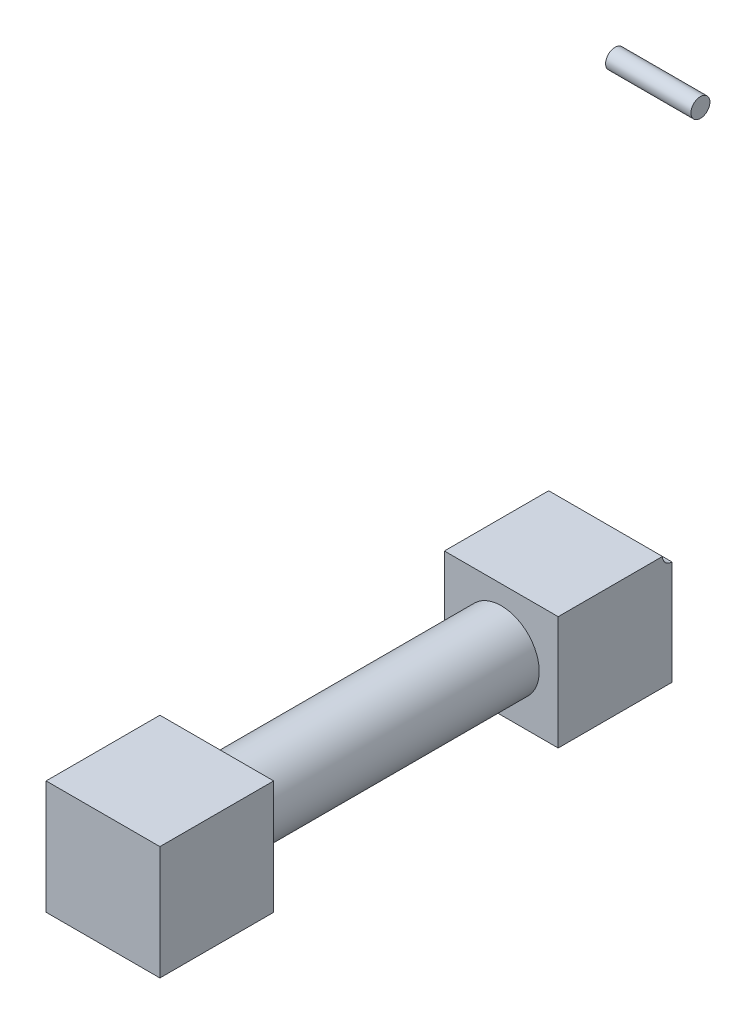
ISO-10303-21;
HEADER;
FILE_DESCRIPTION(('STEP AP214'),'2;1');
FILE_NAME('part.step','',(''),(''),'','','');
FILE_SCHEMA(('AUTOMOTIVE_DESIGN { 1 0 10303 214 1 1 1 1 }'));
ENDSEC;
DATA;
#1=APPLICATION_CONTEXT('core data for automotive mechanical design processes');
#2=APPLICATION_PROTOCOL_DEFINITION('international standard','automotive_design',2000,#1);
#3=PRODUCT_CONTEXT('',#1,'mechanical');
#4=PRODUCT('Part','Part','',(#3));
#5=PRODUCT_RELATED_PRODUCT_CATEGORY('part','',(#4));
#6=PRODUCT_DEFINITION_FORMATION('','',#4);
#7=PRODUCT_DEFINITION_CONTEXT('part definition',#1,'design');
#8=PRODUCT_DEFINITION('design','',#6,#7);
#9=PRODUCT_DEFINITION_SHAPE('','',#8);
#10=(LENGTH_UNIT() NAMED_UNIT(*) SI_UNIT(.MILLI.,.METRE.));
#11=(NAMED_UNIT(*) PLANE_ANGLE_UNIT() SI_UNIT($,.RADIAN.));
#12=(NAMED_UNIT(*) SI_UNIT($,.STERADIAN.) SOLID_ANGLE_UNIT());
#13=UNCERTAINTY_MEASURE_WITH_UNIT(LENGTH_MEASURE(1.E-05),#10,'distance_accuracy_value','');
#14=(GEOMETRIC_REPRESENTATION_CONTEXT(3) GLOBAL_UNCERTAINTY_ASSIGNED_CONTEXT((#13)) GLOBAL_UNIT_ASSIGNED_CONTEXT((#10,
#11,#12)) REPRESENTATION_CONTEXT('',''));
#15=CARTESIAN_POINT('',(0.,0.,0.));
#16=DIRECTION('',(0.,0.,1.));
#17=DIRECTION('',(1.,0.,0.));
#18=AXIS2_PLACEMENT_3D('',#15,#16,#17);
#19=CARTESIAN_POINT('',(45.,240.,0.));
#20=DIRECTION('',(-1.,0.,0.));
#21=DIRECTION('',(0.,0.,1.));
#22=AXIS2_PLACEMENT_3D('',#19,#20,#21);
#23=CYLINDRICAL_SURFACE('',#22,5.);
#24=CARTESIAN_POINT('',(45.,240.,0.));
#25=DIRECTION('',(1.,0.,0.));
#26=DIRECTION('',(0.,0.,-1.));
#27=AXIS2_PLACEMENT_3D('',#24,#25,#26);
#28=CIRCLE('',#27,5.);
#29=CARTESIAN_POINT('',(45.,240.,5.));
#30=VERTEX_POINT('',#29);
#31=EDGE_CURVE('E11',#30,#30,#28,.T.);
#32=CARTESIAN_POINT('',(0.,240.,0.));
#33=DIRECTION('',(1.,0.,0.));
#34=DIRECTION('',(0.,0.,-1.));
#35=AXIS2_PLACEMENT_3D('',#32,#33,#34);
#36=CIRCLE('',#35,5.);
#37=CARTESIAN_POINT('',(0.,240.,5.));
#38=VERTEX_POINT('',#37);
#39=EDGE_CURVE('E49',#38,#38,#36,.T.);
#40=CARTESIAN_POINT('',(45.,240.,5.));
#41=CARTESIAN_POINT('',(44.53125,240.,5.));
#42=CARTESIAN_POINT('',(44.0625,240.,5.));
#43=CARTESIAN_POINT('',(43.125,240.,5.));
#44=CARTESIAN_POINT('',(42.65625,240.,5.));
#45=CARTESIAN_POINT('',(41.71875,240.,5.));
#46=CARTESIAN_POINT('',(41.25,240.,5.));
#47=CARTESIAN_POINT('',(40.3125,240.,5.));
#48=CARTESIAN_POINT('',(39.84375,240.,5.));
#49=CARTESIAN_POINT('',(38.90625,240.,5.));
#50=CARTESIAN_POINT('',(38.4375,240.,5.));
#51=CARTESIAN_POINT('',(37.5,240.,5.));
#52=CARTESIAN_POINT('',(37.03125,240.,5.));
#53=CARTESIAN_POINT('',(36.09375,240.,5.));
#54=CARTESIAN_POINT('',(35.625,240.,5.));
#55=CARTESIAN_POINT('',(34.6875,240.,5.));
#56=CARTESIAN_POINT('',(34.21875,240.,5.));
#57=CARTESIAN_POINT('',(33.28125,240.,5.));
#58=CARTESIAN_POINT('',(32.8125,240.,5.));
#59=CARTESIAN_POINT('',(31.875,240.,5.));
#60=CARTESIAN_POINT('',(31.40625,240.,5.));
#61=CARTESIAN_POINT('',(30.46875,240.,5.));
#62=CARTESIAN_POINT('',(30.,240.,5.));
#63=CARTESIAN_POINT('',(29.0625,240.,5.));
#64=CARTESIAN_POINT('',(28.59375,240.,5.));
#65=CARTESIAN_POINT('',(27.65625,240.,5.));
#66=CARTESIAN_POINT('',(27.1875,240.,5.));
#67=CARTESIAN_POINT('',(26.25,240.,5.));
#68=CARTESIAN_POINT('',(25.78125,240.,5.));
#69=CARTESIAN_POINT('',(24.84375,240.,5.));
#70=CARTESIAN_POINT('',(24.375,240.,5.));
#71=CARTESIAN_POINT('',(23.4375,240.,5.));
#72=CARTESIAN_POINT('',(22.96875,240.,5.));
#73=CARTESIAN_POINT('',(22.03125,240.,5.));
#74=CARTESIAN_POINT('',(21.5625,240.,5.));
#75=CARTESIAN_POINT('',(20.625,240.,5.));
#76=CARTESIAN_POINT('',(20.15625,240.,5.));
#77=CARTESIAN_POINT('',(19.21875,240.,5.));
#78=CARTESIAN_POINT('',(18.75,240.,5.));
#79=CARTESIAN_POINT('',(17.8125,240.,5.));
#80=CARTESIAN_POINT('',(17.34375,240.,5.));
#81=CARTESIAN_POINT('',(16.40625,240.,5.));
#82=CARTESIAN_POINT('',(15.9375,240.,5.));
#83=CARTESIAN_POINT('',(15.,240.,5.));
#84=CARTESIAN_POINT('',(14.53125,240.,5.));
#85=CARTESIAN_POINT('',(13.59375,240.,5.));
#86=CARTESIAN_POINT('',(13.125,240.,5.));
#87=CARTESIAN_POINT('',(12.1875,240.,5.));
#88=CARTESIAN_POINT('',(11.71875,240.,5.));
#89=CARTESIAN_POINT('',(10.78125,240.,5.));
#90=CARTESIAN_POINT('',(10.3125,240.,5.));
#91=CARTESIAN_POINT('',(9.375,240.,5.));
#92=CARTESIAN_POINT('',(8.90625,240.,5.));
#93=CARTESIAN_POINT('',(7.96874999999999,240.,5.));
#94=CARTESIAN_POINT('',(7.5,240.,5.));
#95=CARTESIAN_POINT('',(6.5625,240.,5.));
#96=CARTESIAN_POINT('',(6.09375,240.,5.));
#97=CARTESIAN_POINT('',(5.15625,240.,5.));
#98=CARTESIAN_POINT('',(4.68749999999999,240.,5.));
#99=CARTESIAN_POINT('',(3.74999999999999,240.,5.));
#100=CARTESIAN_POINT('',(3.28124999999999,240.,5.));
#101=CARTESIAN_POINT('',(2.34374999999999,240.,5.));
#102=CARTESIAN_POINT('',(1.87499999999999,240.,5.));
#103=CARTESIAN_POINT('',(0.937499999999992,240.,5.));
#104=CARTESIAN_POINT('',(0.468749999999993,240.,5.));
#105=CARTESIAN_POINT('',(0.,240.,5.));
#106=B_SPLINE_CURVE_WITH_KNOTS('',3,(#40,#41,#42,#43,#44,#45,#46,#47,#48,#49,#50,#51,#52,#53,
#54,#55,#56,#57,#58,#59,#60,#61,#62,#63,#64,#65,#66,#67,#68,#69,#70,#71,#72,#73,#74,#75,#76,#77,
#78,#79,#80,#81,#82,#83,#84,#85,#86,#87,#88,#89,#90,#91,#92,#93,#94,#95,#96,#97,#98,#99,#100,
#101,#102,#103,#104,#105),.UNSPECIFIED.,.F.,.F.,(4,2,2,2,2,2,2,2,2,2,2,2,2,2,2,2,2,2,2,2,2,2,2,
2,2,2,2,2,2,2,2,2,4),(0.,1.40625,2.8125,4.21875000000001,5.62500000000001,7.03125,8.4375,
9.84375000000001,11.25,12.65625,14.0625,15.46875,16.875,18.28125,19.6875,21.09375,22.5,23.90625,
25.3125,26.71875,28.125,29.53125,30.9375,32.34375,33.75,35.15625,36.5625,37.96875,39.375,
40.78125,42.1875,43.59375,45.),.UNSPECIFIED.);
#107=EDGE_CURVE('BSEAM50',#30,#38,#106,.T.);
#108=ORIENTED_EDGE('',*,*,#31,.F.);
#109=ORIENTED_EDGE('',*,*,#39,.T.);
#110=ORIENTED_EDGE('',*,*,#107,.T.);
#111=ORIENTED_EDGE('',*,*,#107,.F.);
#112=EDGE_LOOP('',(#108,#110,#109,#111));
#113=FACE_BOUND('',#112,.T.);
#114=ADVANCED_FACE('F50',(#113),#23,.T.);
#115=CARTESIAN_POINT('',(45.,240.,0.));
#116=DIRECTION('',(1.,0.,0.));
#117=DIRECTION('',(0.,0.,-1.));
#118=AXIS2_PLACEMENT_3D('',#115,#116,#117);
#119=PLANE('',#118);
#120=ORIENTED_EDGE('',*,*,#31,.T.);
#121=EDGE_LOOP('',(#120));
#122=FACE_BOUND('',#121,.T.);
#123=ADVANCED_FACE('F62',(#122),#119,.T.);
#124=CARTESIAN_POINT('',(0.,240.,0.));
#125=DIRECTION('',(1.,0.,0.));
#126=DIRECTION('',(0.,0.,-1.));
#127=AXIS2_PLACEMENT_3D('',#124,#125,#126);
#128=PLANE('',#127);
#129=ORIENTED_EDGE('',*,*,#39,.F.);
#130=EDGE_LOOP('',(#129));
#131=FACE_BOUND('',#130,.T.);
#132=ADVANCED_FACE('F58',(#131),#128,.F.);
#133=CLOSED_SHELL('',(#114,#123,#132));
#134=MANIFOLD_SOLID_BREP('B2',#133);
#135=CARTESIAN_POINT('',(30.,-30.,60.));
#136=DIRECTION('',(-1.,0.,0.));
#137=DIRECTION('',(0.,0.,1.));
#138=AXIS2_PLACEMENT_3D('',#135,#136,#137);
#139=PLANE('',#138);
#140=DIRECTION('',(0.,1.,0.));
#141=VECTOR('',#140,1.);
#142=CARTESIAN_POINT('',(30.,-30.,0.));
#143=LINE('',#142,#141);
#144=CARTESIAN_POINT('',(30.,-30.,0.));
#145=VERTEX_POINT('',#144);
#146=CARTESIAN_POINT('',(30.,25.,0.));
#147=VERTEX_POINT('',#146);
#148=EDGE_CURVE('E185',#145,#147,#143,.T.);
#149=ORIENTED_EDGE('',*,*,#148,.T.);
#150=CARTESIAN_POINT('',(30.,30.,0.));
#151=DIRECTION('',(-1.,0.,0.));
#152=DIRECTION('',(0.,0.,1.));
#153=AXIS2_PLACEMENT_3D('',#150,#151,#152);
#154=CIRCLE('',#153,5.);
#155=CARTESIAN_POINT('',(30.,30.,5.));
#156=VERTEX_POINT('',#155);
#157=EDGE_CURVE('E101',#147,#156,#154,.T.);
#158=ORIENTED_EDGE('',*,*,#157,.T.);
#159=DIRECTION('',(0.,0.,-1.));
#160=VECTOR('',#159,1.);
#161=CARTESIAN_POINT('',(30.,30.,60.));
#162=LINE('',#161,#160);
#163=CARTESIAN_POINT('',(30.,30.,60.));
#164=VERTEX_POINT('',#163);
#165=EDGE_CURVE('E194',#164,#156,#162,.T.);
#166=ORIENTED_EDGE('',*,*,#165,.F.);
#167=DIRECTION('',(0.,1.,0.));
#168=VECTOR('',#167,1.);
#169=CARTESIAN_POINT('',(30.,-30.,60.));
#170=LINE('',#169,#168);
#171=CARTESIAN_POINT('',(30.,-30.,60.));
#172=VERTEX_POINT('',#171);
#173=EDGE_CURVE('E184',#172,#164,#170,.T.);
#174=ORIENTED_EDGE('',*,*,#173,.F.);
#175=DIRECTION('',(0.,0.,-1.));
#176=VECTOR('',#175,1.);
#177=CARTESIAN_POINT('',(30.,-30.,60.));
#178=LINE('',#177,#176);
#179=EDGE_CURVE('E186',#172,#145,#178,.T.);
#180=ORIENTED_EDGE('',*,*,#179,.T.);
#181=EDGE_LOOP('',(#149,#158,#166,#174,#180));
#182=FACE_BOUND('',#181,.T.);
#183=ADVANCED_FACE('F86',(#182),#139,.F.);
#184=CARTESIAN_POINT('',(-30.,30.,60.));
#185=DIRECTION('',(0.,-1.,0.));
#186=DIRECTION('',(0.,0.,-1.));
#187=AXIS2_PLACEMENT_3D('',#184,#185,#186);
#188=PLANE('',#187);
#189=ORIENTED_EDGE('',*,*,#165,.T.);
#190=DIRECTION('',(1.,0.,0.));
#191=VECTOR('',#190,1.);
#192=CARTESIAN_POINT('',(-100.,30.,5.));
#193=LINE('',#192,#191);
#194=CARTESIAN_POINT('',(-30.,30.,5.));
#195=VERTEX_POINT('',#194);
#196=EDGE_CURVE('E176',#156,#195,#193,.F.);
#197=ORIENTED_EDGE('',*,*,#196,.T.);
#198=DIRECTION('',(0.,0.,-1.));
#199=VECTOR('',#198,1.);
#200=CARTESIAN_POINT('',(-30.,30.,60.));
#201=LINE('',#200,#199);
#202=CARTESIAN_POINT('',(-30.,30.,60.));
#203=VERTEX_POINT('',#202);
#204=EDGE_CURVE('E179',#203,#195,#201,.T.);
#205=ORIENTED_EDGE('',*,*,#204,.F.);
#206=DIRECTION('',(-1.,0.,0.));
#207=VECTOR('',#206,1.);
#208=CARTESIAN_POINT('',(-30.,30.,60.));
#209=LINE('',#208,#207);
#210=EDGE_CURVE('E132',#164,#203,#209,.T.);
#211=ORIENTED_EDGE('',*,*,#210,.F.);
#212=EDGE_LOOP('',(#189,#197,#205,#211));
#213=FACE_BOUND('',#212,.T.);
#214=ADVANCED_FACE('F262',(#213),#188,.F.);
#215=CARTESIAN_POINT('',(-30.,-30.,60.));
#216=DIRECTION('',(1.,0.,0.));
#217=DIRECTION('',(0.,0.,-1.));
#218=AXIS2_PLACEMENT_3D('',#215,#216,#217);
#219=PLANE('',#218);
#220=ORIENTED_EDGE('',*,*,#204,.T.);
#221=CARTESIAN_POINT('',(-30.,30.,0.));
#222=DIRECTION('',(1.,0.,0.));
#223=DIRECTION('',(0.,0.,-1.));
#224=AXIS2_PLACEMENT_3D('',#221,#222,#223);
#225=CIRCLE('',#224,5.);
#226=CARTESIAN_POINT('',(-30.,25.,0.));
#227=VERTEX_POINT('',#226);
#228=EDGE_CURVE('E167',#195,#227,#225,.T.);
#229=ORIENTED_EDGE('',*,*,#228,.T.);
#230=DIRECTION('',(0.,-1.,0.));
#231=VECTOR('',#230,1.);
#232=CARTESIAN_POINT('',(-30.,-30.,0.));
#233=LINE('',#232,#231);
#234=CARTESIAN_POINT('',(-30.,-30.,0.));
#235=VERTEX_POINT('',#234);
#236=EDGE_CURVE('E177',#227,#235,#233,.T.);
#237=ORIENTED_EDGE('',*,*,#236,.T.);
#238=DIRECTION('',(0.,0.,-1.));
#239=VECTOR('',#238,1.);
#240=CARTESIAN_POINT('',(-30.,-30.,60.));
#241=LINE('',#240,#239);
#242=CARTESIAN_POINT('',(-30.,-30.,60.));
#243=VERTEX_POINT('',#242);
#244=EDGE_CURVE('E195',#243,#235,#241,.T.);
#245=ORIENTED_EDGE('',*,*,#244,.F.);
#246=DIRECTION('',(0.,-1.,0.));
#247=VECTOR('',#246,1.);
#248=CARTESIAN_POINT('',(-30.,-30.,60.));
#249=LINE('',#248,#247);
#250=EDGE_CURVE('E202',#203,#243,#249,.T.);
#251=ORIENTED_EDGE('',*,*,#250,.F.);
#252=EDGE_LOOP('',(#220,#229,#237,#245,#251));
#253=FACE_BOUND('',#252,.T.);
#254=ADVANCED_FACE('F173',(#253),#219,.F.);
#255=CARTESIAN_POINT('',(-30.,-30.,60.));
#256=DIRECTION('',(0.,1.,0.));
#257=DIRECTION('',(0.,0.,1.));
#258=AXIS2_PLACEMENT_3D('',#255,#256,#257);
#259=PLANE('',#258);
#260=DIRECTION('',(1.,0.,0.));
#261=VECTOR('',#260,1.);
#262=CARTESIAN_POINT('',(-30.,-30.,0.));
#263=LINE('',#262,#261);
#264=EDGE_CURVE('E123',#235,#145,#263,.T.);
#265=ORIENTED_EDGE('',*,*,#264,.T.);
#266=ORIENTED_EDGE('',*,*,#179,.F.);
#267=DIRECTION('',(1.,0.,0.));
#268=VECTOR('',#267,1.);
#269=CARTESIAN_POINT('',(-30.,-30.,60.));
#270=LINE('',#269,#268);
#271=EDGE_CURVE('E109',#243,#172,#270,.T.);
#272=ORIENTED_EDGE('',*,*,#271,.F.);
#273=ORIENTED_EDGE('',*,*,#244,.T.);
#274=EDGE_LOOP('',(#265,#266,#272,#273));
#275=FACE_BOUND('',#274,.T.);
#276=ADVANCED_FACE('F210',(#275),#259,.F.);
#277=CARTESIAN_POINT('',(0.,0.,60.));
#278=DIRECTION('',(0.,0.,-1.));
#279=DIRECTION('',(-1.,0.,0.));
#280=AXIS2_PLACEMENT_3D('',#277,#278,#279);
#281=PLANE('',#280);
#282=CARTESIAN_POINT('',(0.,0.,60.));
#283=DIRECTION('',(0.,0.,1.));
#284=DIRECTION('',(1.,0.,0.));
#285=AXIS2_PLACEMENT_3D('',#282,#283,#284);
#286=CIRCLE('',#285,20.);
#287=CARTESIAN_POINT('',(20.,0.,60.));
#288=VERTEX_POINT('',#287);
#289=EDGE_CURVE('E92',#288,#288,#286,.T.);
#290=ORIENTED_EDGE('',*,*,#289,.F.);
#291=EDGE_LOOP('',(#290));
#292=FACE_BOUND('',#291,.T.);
#293=ORIENTED_EDGE('',*,*,#173,.T.);
#294=ORIENTED_EDGE('',*,*,#210,.T.);
#295=ORIENTED_EDGE('',*,*,#250,.T.);
#296=ORIENTED_EDGE('',*,*,#271,.T.);
#297=EDGE_LOOP('',(#293,#294,#295,#296));
#298=FACE_BOUND('',#297,.T.);
#299=ADVANCED_FACE('F206',(#292,#298),#281,.F.);
#300=CARTESIAN_POINT('',(0.,0.,0.));
#301=DIRECTION('',(0.,0.,-1.));
#302=DIRECTION('',(-1.,0.,0.));
#303=AXIS2_PLACEMENT_3D('',#300,#301,#302);
#304=PLANE('',#303);
#305=DIRECTION('',(1.,0.,0.));
#306=VECTOR('',#305,1.);
#307=CARTESIAN_POINT('',(-100.,25.,0.));
#308=LINE('',#307,#306);
#309=EDGE_CURVE('E44',#147,#227,#308,.F.);
#310=ORIENTED_EDGE('',*,*,#309,.F.);
#311=ORIENTED_EDGE('',*,*,#148,.F.);
#312=ORIENTED_EDGE('',*,*,#264,.F.);
#313=ORIENTED_EDGE('',*,*,#236,.F.);
#314=EDGE_LOOP('',(#310,#311,#312,#313));
#315=FACE_BOUND('',#314,.T.);
#316=ADVANCED_FACE('F182',(#315),#304,.T.);
#317=CARTESIAN_POINT('',(0.,0.,210.));
#318=DIRECTION('',(0.,0.,-1.));
#319=DIRECTION('',(-1.,0.,0.));
#320=AXIS2_PLACEMENT_3D('',#317,#318,#319);
#321=CYLINDRICAL_SURFACE('',#320,20.);
#322=CARTESIAN_POINT('',(0.,0.,210.));
#323=DIRECTION('',(0.,0.,1.));
#324=DIRECTION('',(1.,0.,0.));
#325=AXIS2_PLACEMENT_3D('',#322,#323,#324);
#326=CIRCLE('',#325,20.);
#327=CARTESIAN_POINT('',(20.,0.,210.));
#328=VERTEX_POINT('',#327);
#329=EDGE_CURVE('E188',#328,#328,#326,.T.);
#330=ORIENTED_EDGE('',*,*,#329,.F.);
#331=EDGE_LOOP('',(#330));
#332=FACE_BOUND('',#331,.T.);
#333=ORIENTED_EDGE('',*,*,#289,.T.);
#334=EDGE_LOOP('',(#333));
#335=FACE_BOUND('',#334,.T.);
#336=ADVANCED_FACE('F249',(#332,#335),#321,.T.);
#337=CARTESIAN_POINT('',(30.,-30.,270.));
#338=DIRECTION('',(-1.,0.,0.));
#339=DIRECTION('',(0.,0.,1.));
#340=AXIS2_PLACEMENT_3D('',#337,#338,#339);
#341=PLANE('',#340);
#342=DIRECTION('',(0.,1.,0.));
#343=VECTOR('',#342,1.);
#344=CARTESIAN_POINT('',(30.,-30.,210.));
#345=LINE('',#344,#343);
#346=CARTESIAN_POINT('',(30.,-30.,210.));
#347=VERTEX_POINT('',#346);
#348=CARTESIAN_POINT('',(30.,30.,210.));
#349=VERTEX_POINT('',#348);
#350=EDGE_CURVE('E209',#347,#349,#345,.T.);
#351=ORIENTED_EDGE('',*,*,#350,.T.);
#352=DIRECTION('',(0.,0.,-1.));
#353=VECTOR('',#352,1.);
#354=CARTESIAN_POINT('',(30.,30.,270.));
#355=LINE('',#354,#353);
#356=CARTESIAN_POINT('',(30.,30.,270.));
#357=VERTEX_POINT('',#356);
#358=EDGE_CURVE('E239',#357,#349,#355,.T.);
#359=ORIENTED_EDGE('',*,*,#358,.F.);
#360=DIRECTION('',(0.,1.,0.));
#361=VECTOR('',#360,1.);
#362=CARTESIAN_POINT('',(30.,-30.,270.));
#363=LINE('',#362,#361);
#364=CARTESIAN_POINT('',(30.,-30.,270.));
#365=VERTEX_POINT('',#364);
#366=EDGE_CURVE('E220',#365,#357,#363,.T.);
#367=ORIENTED_EDGE('',*,*,#366,.F.);
#368=DIRECTION('',(0.,0.,-1.));
#369=VECTOR('',#368,1.);
#370=CARTESIAN_POINT('',(30.,-30.,270.));
#371=LINE('',#370,#369);
#372=EDGE_CURVE('E226',#365,#347,#371,.T.);
#373=ORIENTED_EDGE('',*,*,#372,.T.);
#374=EDGE_LOOP('',(#351,#359,#367,#373));
#375=FACE_BOUND('',#374,.T.);
#376=ADVANCED_FACE('F253',(#375),#341,.F.);
#377=CARTESIAN_POINT('',(-30.,30.,270.));
#378=DIRECTION('',(0.,-1.,0.));
#379=DIRECTION('',(0.,0.,-1.));
#380=AXIS2_PLACEMENT_3D('',#377,#378,#379);
#381=PLANE('',#380);
#382=DIRECTION('',(-1.,0.,0.));
#383=VECTOR('',#382,1.);
#384=CARTESIAN_POINT('',(-30.,30.,210.));
#385=LINE('',#384,#383);
#386=CARTESIAN_POINT('',(-30.,30.,210.));
#387=VERTEX_POINT('',#386);
#388=EDGE_CURVE('E213',#349,#387,#385,.T.);
#389=ORIENTED_EDGE('',*,*,#388,.T.);
#390=DIRECTION('',(0.,0.,-1.));
#391=VECTOR('',#390,1.);
#392=CARTESIAN_POINT('',(-30.,30.,270.));
#393=LINE('',#392,#391);
#394=CARTESIAN_POINT('',(-30.,30.,270.));
#395=VERTEX_POINT('',#394);
#396=EDGE_CURVE('E240',#395,#387,#393,.T.);
#397=ORIENTED_EDGE('',*,*,#396,.F.);
#398=DIRECTION('',(-1.,0.,0.));
#399=VECTOR('',#398,1.);
#400=CARTESIAN_POINT('',(-30.,30.,270.));
#401=LINE('',#400,#399);
#402=EDGE_CURVE('E219',#357,#395,#401,.T.);
#403=ORIENTED_EDGE('',*,*,#402,.F.);
#404=ORIENTED_EDGE('',*,*,#358,.T.);
#405=EDGE_LOOP('',(#389,#397,#403,#404));
#406=FACE_BOUND('',#405,.T.);
#407=ADVANCED_FACE('F260',(#406),#381,.F.);
#408=CARTESIAN_POINT('',(-30.,-30.,270.));
#409=DIRECTION('',(1.,0.,0.));
#410=DIRECTION('',(0.,0.,-1.));
#411=AXIS2_PLACEMENT_3D('',#408,#409,#410);
#412=PLANE('',#411);
#413=DIRECTION('',(0.,-1.,0.));
#414=VECTOR('',#413,1.);
#415=CARTESIAN_POINT('',(-30.,-30.,210.));
#416=LINE('',#415,#414);
#417=CARTESIAN_POINT('',(-30.,-30.,210.));
#418=VERTEX_POINT('',#417);
#419=EDGE_CURVE('E228',#387,#418,#416,.T.);
#420=ORIENTED_EDGE('',*,*,#419,.T.);
#421=DIRECTION('',(0.,0.,-1.));
#422=VECTOR('',#421,1.);
#423=CARTESIAN_POINT('',(-30.,-30.,270.));
#424=LINE('',#423,#422);
#425=CARTESIAN_POINT('',(-30.,-30.,270.));
#426=VERTEX_POINT('',#425);
#427=EDGE_CURVE('E231',#426,#418,#424,.T.);
#428=ORIENTED_EDGE('',*,*,#427,.F.);
#429=DIRECTION('',(0.,-1.,0.));
#430=VECTOR('',#429,1.);
#431=CARTESIAN_POINT('',(-30.,-30.,270.));
#432=LINE('',#431,#430);
#433=EDGE_CURVE('E224',#395,#426,#432,.T.);
#434=ORIENTED_EDGE('',*,*,#433,.F.);
#435=ORIENTED_EDGE('',*,*,#396,.T.);
#436=EDGE_LOOP('',(#420,#428,#434,#435));
#437=FACE_BOUND('',#436,.T.);
#438=ADVANCED_FACE('F339',(#437),#412,.F.);
#439=CARTESIAN_POINT('',(-30.,-30.,270.));
#440=DIRECTION('',(0.,1.,0.));
#441=DIRECTION('',(0.,0.,1.));
#442=AXIS2_PLACEMENT_3D('',#439,#440,#441);
#443=PLANE('',#442);
#444=DIRECTION('',(1.,0.,0.));
#445=VECTOR('',#444,1.);
#446=CARTESIAN_POINT('',(-30.,-30.,210.));
#447=LINE('',#446,#445);
#448=EDGE_CURVE('E222',#418,#347,#447,.T.);
#449=ORIENTED_EDGE('',*,*,#448,.T.);
#450=ORIENTED_EDGE('',*,*,#372,.F.);
#451=DIRECTION('',(1.,0.,0.));
#452=VECTOR('',#451,1.);
#453=CARTESIAN_POINT('',(-30.,-30.,270.));
#454=LINE('',#453,#452);
#455=EDGE_CURVE('E223',#426,#365,#454,.T.);
#456=ORIENTED_EDGE('',*,*,#455,.F.);
#457=ORIENTED_EDGE('',*,*,#427,.T.);
#458=EDGE_LOOP('',(#449,#450,#456,#457));
#459=FACE_BOUND('',#458,.T.);
#460=ADVANCED_FACE('F327',(#459),#443,.F.);
#461=CARTESIAN_POINT('',(0.,0.,270.));
#462=DIRECTION('',(0.,0.,-1.));
#463=DIRECTION('',(-1.,0.,0.));
#464=AXIS2_PLACEMENT_3D('',#461,#462,#463);
#465=PLANE('',#464);
#466=ORIENTED_EDGE('',*,*,#366,.T.);
#467=ORIENTED_EDGE('',*,*,#402,.T.);
#468=ORIENTED_EDGE('',*,*,#433,.T.);
#469=ORIENTED_EDGE('',*,*,#455,.T.);
#470=EDGE_LOOP('',(#466,#467,#468,#469));
#471=FACE_BOUND('',#470,.T.);
#472=ADVANCED_FACE('F317',(#471),#465,.F.);
#473=CARTESIAN_POINT('',(0.,0.,210.));
#474=DIRECTION('',(0.,0.,-1.));
#475=DIRECTION('',(-1.,0.,0.));
#476=AXIS2_PLACEMENT_3D('',#473,#474,#475);
#477=PLANE('',#476);
#478=ORIENTED_EDGE('',*,*,#329,.T.);
#479=EDGE_LOOP('',(#478));
#480=FACE_BOUND('',#479,.T.);
#481=ORIENTED_EDGE('',*,*,#350,.F.);
#482=ORIENTED_EDGE('',*,*,#448,.F.);
#483=ORIENTED_EDGE('',*,*,#419,.F.);
#484=ORIENTED_EDGE('',*,*,#388,.F.);
#485=EDGE_LOOP('',(#481,#482,#483,#484));
#486=FACE_BOUND('',#485,.T.);
#487=ADVANCED_FACE('F247',(#480,#486),#477,.T.);
#488=CARTESIAN_POINT('',(-100.,30.,0.));
#489=DIRECTION('',(1.,0.,0.));
#490=DIRECTION('',(0.,0.,-1.));
#491=AXIS2_PLACEMENT_3D('',#488,#489,#490);
#492=CYLINDRICAL_SURFACE('',#491,5.);
#493=ORIENTED_EDGE('',*,*,#309,.T.);
#494=ORIENTED_EDGE('',*,*,#228,.F.);
#495=ORIENTED_EDGE('',*,*,#196,.F.);
#496=ORIENTED_EDGE('',*,*,#157,.F.);
#497=EDGE_LOOP('',(#493,#494,#495,#496));
#498=FACE_BOUND('',#497,.T.);
#499=ADVANCED_FACE('F164',(#498),#492,.F.);
#500=CLOSED_SHELL('',(#183,#214,#254,#276,#299,#316,#336,#376,#407,#438,#460,#472,#487,#499));
#501=MANIFOLD_SOLID_BREP('B6',#500);
#502=ADVANCED_BREP_SHAPE_REPRESENTATION('',(#18,#134,#501),#14);
#503=SHAPE_DEFINITION_REPRESENTATION(#9,#502);
ENDSEC;
END-ISO-10303-21;
